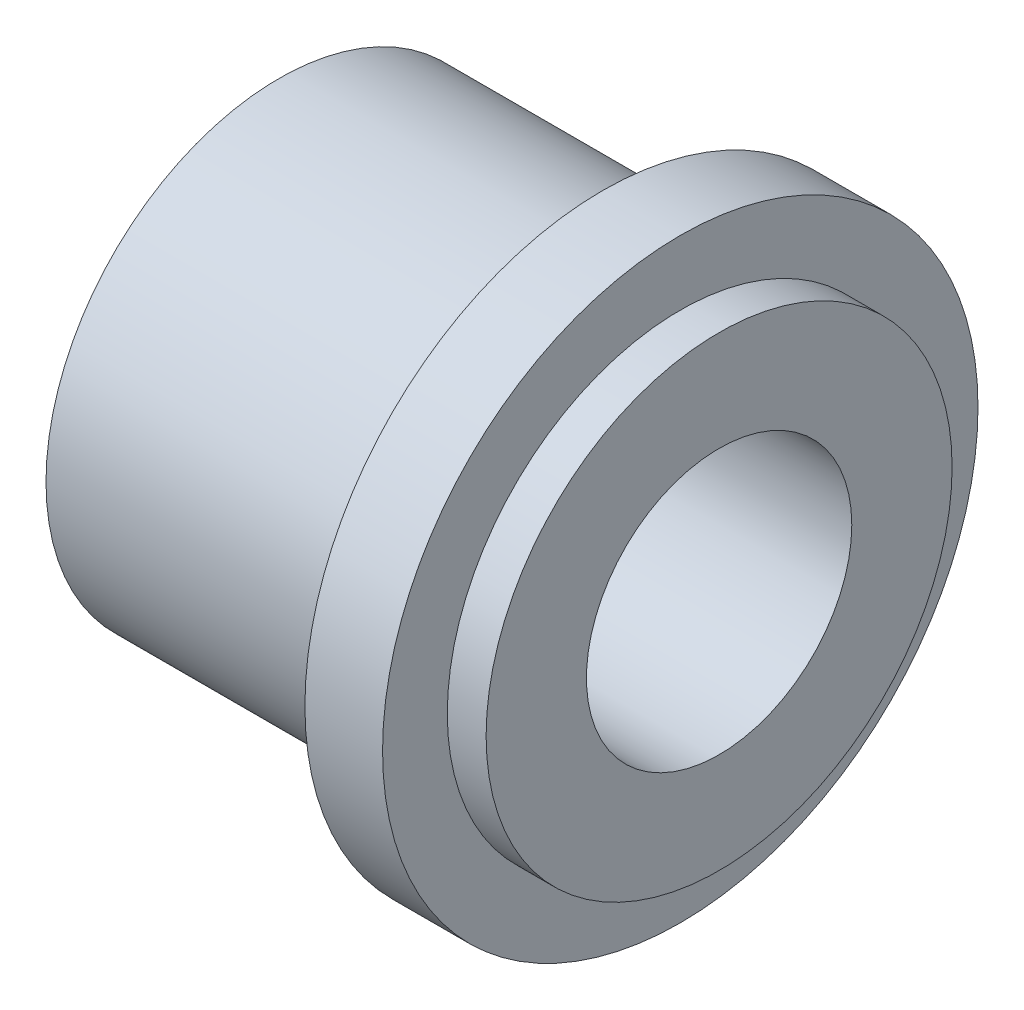
ISO-10303-21;
HEADER;
FILE_DESCRIPTION(('STEP AP214'),'2;1');
FILE_NAME('part.step','',(''),(''),'','','');
FILE_SCHEMA(('AUTOMOTIVE_DESIGN { 1 0 10303 214 1 1 1 1 }'));
ENDSEC;
DATA;
#1=APPLICATION_CONTEXT('core data for automotive mechanical design processes');
#2=APPLICATION_PROTOCOL_DEFINITION('international standard','automotive_design',2000,#1);
#3=PRODUCT_CONTEXT('',#1,'mechanical');
#4=PRODUCT('Part','Part','',(#3));
#5=PRODUCT_RELATED_PRODUCT_CATEGORY('part','',(#4));
#6=PRODUCT_DEFINITION_FORMATION('','',#4);
#7=PRODUCT_DEFINITION_CONTEXT('part definition',#1,'design');
#8=PRODUCT_DEFINITION('design','',#6,#7);
#9=PRODUCT_DEFINITION_SHAPE('','',#8);
#10=(LENGTH_UNIT() NAMED_UNIT(*) SI_UNIT(.MILLI.,.METRE.));
#11=(NAMED_UNIT(*) PLANE_ANGLE_UNIT() SI_UNIT($,.RADIAN.));
#12=(NAMED_UNIT(*) SI_UNIT($,.STERADIAN.) SOLID_ANGLE_UNIT());
#13=UNCERTAINTY_MEASURE_WITH_UNIT(LENGTH_MEASURE(1.E-05),#10,'distance_accuracy_value','');
#14=(GEOMETRIC_REPRESENTATION_CONTEXT(3) GLOBAL_UNCERTAINTY_ASSIGNED_CONTEXT((#13)) GLOBAL_UNIT_ASSIGNED_CONTEXT((#10,
#11,#12)) REPRESENTATION_CONTEXT('',''));
#15=CARTESIAN_POINT('',(0.,0.,0.));
#16=DIRECTION('',(0.,0.,1.));
#17=DIRECTION('',(1.,0.,0.));
#18=AXIS2_PLACEMENT_3D('',#15,#16,#17);
#19=CARTESIAN_POINT('',(6.,0.,0.));
#20=DIRECTION('',(-1.,0.,0.));
#21=DIRECTION('',(0.,0.,1.));
#22=AXIS2_PLACEMENT_3D('',#19,#20,#21);
#23=CYLINDRICAL_SURFACE('',#22,23.);
#24=CARTESIAN_POINT('',(6.,0.,0.));
#25=DIRECTION('',(1.,0.,0.));
#26=DIRECTION('',(0.,0.,-1.));
#27=AXIS2_PLACEMENT_3D('',#24,#25,#26);
#28=CIRCLE('',#27,23.);
#29=CARTESIAN_POINT('',(6.,0.,-23.));
#30=VERTEX_POINT('',#29);
#31=EDGE_CURVE('E49',#30,#30,#28,.T.);
#32=ORIENTED_EDGE('',*,*,#31,.F.);
#33=EDGE_LOOP('',(#32));
#34=FACE_BOUND('',#33,.T.);
#35=CARTESIAN_POINT('',(0.,0.,0.));
#36=DIRECTION('',(1.,0.,0.));
#37=DIRECTION('',(0.,0.,-1.));
#38=AXIS2_PLACEMENT_3D('',#35,#36,#37);
#39=CIRCLE('',#38,23.);
#40=CARTESIAN_POINT('',(0.,0.,-23.));
#41=VERTEX_POINT('',#40);
#42=EDGE_CURVE('E55',#41,#41,#39,.T.);
#43=ORIENTED_EDGE('',*,*,#42,.T.);
#44=EDGE_LOOP('',(#43));
#45=FACE_BOUND('',#44,.T.);
#46=ADVANCED_FACE('F41',(#34,#45),#23,.T.);
#47=CARTESIAN_POINT('',(6.,0.,0.));
#48=DIRECTION('',(1.,0.,0.));
#49=DIRECTION('',(0.,0.,-1.));
#50=AXIS2_PLACEMENT_3D('',#47,#48,#49);
#51=PLANE('',#50);
#52=CARTESIAN_POINT('',(6.,0.,0.));
#53=DIRECTION('',(1.,0.,0.));
#54=DIRECTION('',(0.,0.,-1.));
#55=AXIS2_PLACEMENT_3D('',#52,#53,#54);
#56=CIRCLE('',#55,18.);
#57=CARTESIAN_POINT('',(6.,0.,-18.));
#58=VERTEX_POINT('',#57);
#59=EDGE_CURVE('E10',#58,#58,#56,.T.);
#60=ORIENTED_EDGE('',*,*,#59,.F.);
#61=EDGE_LOOP('',(#60));
#62=FACE_BOUND('',#61,.T.);
#63=ORIENTED_EDGE('',*,*,#31,.T.);
#64=EDGE_LOOP('',(#63));
#65=FACE_BOUND('',#64,.T.);
#66=ADVANCED_FACE('F104',(#62,#65),#51,.T.);
#67=CARTESIAN_POINT('',(0.,0.,0.));
#68=DIRECTION('',(1.,0.,0.));
#69=DIRECTION('',(0.,0.,-1.));
#70=AXIS2_PLACEMENT_3D('',#67,#68,#69);
#71=PLANE('',#70);
#72=CARTESIAN_POINT('',(0.,0.,0.));
#73=DIRECTION('',(1.,0.,0.));
#74=DIRECTION('',(0.,0.,-1.));
#75=AXIS2_PLACEMENT_3D('',#72,#73,#74);
#76=CIRCLE('',#75,18.);
#77=CARTESIAN_POINT('',(0.,0.,-18.));
#78=VERTEX_POINT('',#77);
#79=EDGE_CURVE('E44',#78,#78,#76,.T.);
#80=ORIENTED_EDGE('',*,*,#79,.T.);
#81=EDGE_LOOP('',(#80));
#82=FACE_BOUND('',#81,.T.);
#83=ORIENTED_EDGE('',*,*,#42,.F.);
#84=EDGE_LOOP('',(#83));
#85=FACE_BOUND('',#84,.T.);
#86=ADVANCED_FACE('F109',(#82,#85),#71,.F.);
#87=CARTESIAN_POINT('',(-25.,0.,0.));
#88=DIRECTION('',(-1.,0.,0.));
#89=DIRECTION('',(0.,0.,1.));
#90=AXIS2_PLACEMENT_3D('',#87,#88,#89);
#91=PLANE('',#90);
#92=CARTESIAN_POINT('',(-25.,0.,0.));
#93=DIRECTION('',(1.,0.,0.));
#94=DIRECTION('',(0.,0.,-1.));
#95=AXIS2_PLACEMENT_3D('',#92,#93,#94);
#96=CIRCLE('',#95,10.25);
#97=CARTESIAN_POINT('',(-25.,0.,-10.25));
#98=VERTEX_POINT('',#97);
#99=EDGE_CURVE('E75',#98,#98,#96,.T.);
#100=ORIENTED_EDGE('',*,*,#99,.T.);
#101=EDGE_LOOP('',(#100));
#102=FACE_BOUND('',#101,.T.);
#103=CARTESIAN_POINT('',(-25.,0.,0.));
#104=DIRECTION('',(-1.,0.,0.));
#105=DIRECTION('',(0.,0.,1.));
#106=AXIS2_PLACEMENT_3D('',#103,#104,#105);
#107=CIRCLE('',#106,18.);
#108=CARTESIAN_POINT('',(-25.,0.,18.));
#109=VERTEX_POINT('',#108);
#110=EDGE_CURVE('E70',#109,#109,#107,.T.);
#111=ORIENTED_EDGE('',*,*,#110,.T.);
#112=EDGE_LOOP('',(#111));
#113=FACE_BOUND('',#112,.T.);
#114=ADVANCED_FACE('F117',(#102,#113),#91,.T.);
#115=CARTESIAN_POINT('',(9.,0.,0.));
#116=DIRECTION('',(-1.,0.,0.));
#117=DIRECTION('',(0.,0.,1.));
#118=AXIS2_PLACEMENT_3D('',#115,#116,#117);
#119=CYLINDRICAL_SURFACE('',#118,18.);
#120=ORIENTED_EDGE('',*,*,#110,.F.);
#121=EDGE_LOOP('',(#120));
#122=FACE_BOUND('',#121,.T.);
#123=ORIENTED_EDGE('',*,*,#79,.F.);
#124=EDGE_LOOP('',(#123));
#125=FACE_BOUND('',#124,.T.);
#126=ADVANCED_FACE('F100',(#122,#125),#119,.T.);
#127=ORIENTED_EDGE('',*,*,#59,.T.);
#128=EDGE_LOOP('',(#127));
#129=FACE_BOUND('',#128,.T.);
#130=CARTESIAN_POINT('',(9.,0.,0.));
#131=DIRECTION('',(-1.,0.,0.));
#132=DIRECTION('',(0.,0.,1.));
#133=AXIS2_PLACEMENT_3D('',#130,#131,#132);
#134=CIRCLE('',#133,18.);
#135=CARTESIAN_POINT('',(9.,0.,18.));
#136=VERTEX_POINT('',#135);
#137=EDGE_CURVE('E58',#136,#136,#134,.T.);
#138=ORIENTED_EDGE('',*,*,#137,.T.);
#139=EDGE_LOOP('',(#138));
#140=FACE_BOUND('',#139,.T.);
#141=ADVANCED_FACE('F92',(#129,#140),#119,.T.);
#142=CARTESIAN_POINT('',(9.,0.,0.));
#143=DIRECTION('',(-1.,0.,0.));
#144=DIRECTION('',(0.,0.,1.));
#145=AXIS2_PLACEMENT_3D('',#142,#143,#144);
#146=PLANE('',#145);
#147=CARTESIAN_POINT('',(9.,0.,0.));
#148=DIRECTION('',(1.,0.,0.));
#149=DIRECTION('',(0.,0.,-1.));
#150=AXIS2_PLACEMENT_3D('',#147,#148,#149);
#151=CIRCLE('',#150,10.25);
#152=CARTESIAN_POINT('',(9.,0.,-10.25));
#153=VERTEX_POINT('',#152);
#154=EDGE_CURVE('E80',#153,#153,#151,.T.);
#155=ORIENTED_EDGE('',*,*,#154,.F.);
#156=EDGE_LOOP('',(#155));
#157=FACE_BOUND('',#156,.T.);
#158=ORIENTED_EDGE('',*,*,#137,.F.);
#159=EDGE_LOOP('',(#158));
#160=FACE_BOUND('',#159,.T.);
#161=ADVANCED_FACE('F89',(#157,#160),#146,.F.);
#162=CARTESIAN_POINT('',(-25.,0.,0.));
#163=DIRECTION('',(1.,0.,0.));
#164=DIRECTION('',(0.,0.,-1.));
#165=AXIS2_PLACEMENT_3D('',#162,#163,#164);
#166=CYLINDRICAL_SURFACE('',#165,10.25);
#167=ORIENTED_EDGE('',*,*,#99,.F.);
#168=EDGE_LOOP('',(#167));
#169=FACE_BOUND('',#168,.T.);
#170=ORIENTED_EDGE('',*,*,#154,.T.);
#171=EDGE_LOOP('',(#170));
#172=FACE_BOUND('',#171,.T.);
#173=ADVANCED_FACE('F87',(#169,#172),#166,.F.);
#174=CLOSED_SHELL('',(#46,#66,#86,#114,#126,#141,#161,#173));
#175=MANIFOLD_SOLID_BREP('B2',#174);
#176=ADVANCED_BREP_SHAPE_REPRESENTATION('',(#18,#175),#14);
#177=SHAPE_DEFINITION_REPRESENTATION(#9,#176);
ENDSEC;
END-ISO-10303-21;
